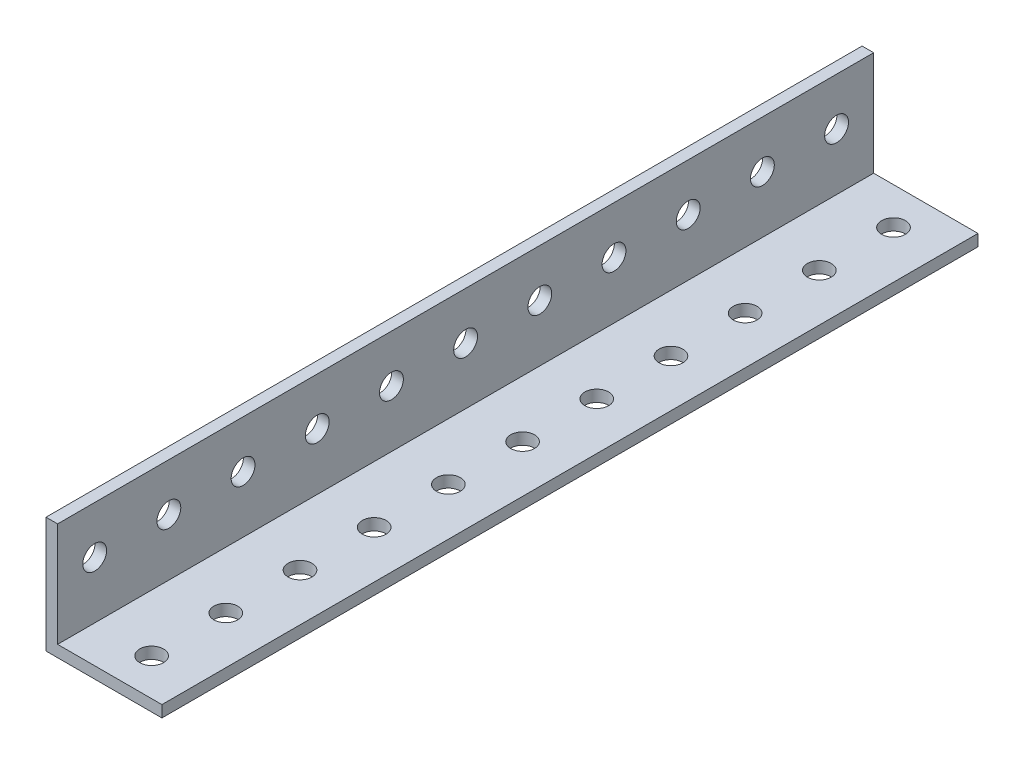
ISO-10303-21;
HEADER;
FILE_DESCRIPTION(('STEP AP214'),'2;1');
FILE_NAME('part.step','',(''),(''),'','','');
FILE_SCHEMA(('AUTOMOTIVE_DESIGN { 1 0 10303 214 1 1 1 1 }'));
ENDSEC;
DATA;
#1=APPLICATION_CONTEXT('core data for automotive mechanical design processes');
#2=APPLICATION_PROTOCOL_DEFINITION('international standard','automotive_design',2000,#1);
#3=PRODUCT_CONTEXT('',#1,'mechanical');
#4=PRODUCT('Part','Part','',(#3));
#5=PRODUCT_RELATED_PRODUCT_CATEGORY('part','',(#4));
#6=PRODUCT_DEFINITION_FORMATION('','',#4);
#7=PRODUCT_DEFINITION_CONTEXT('part definition',#1,'design');
#8=PRODUCT_DEFINITION('design','',#6,#7);
#9=PRODUCT_DEFINITION_SHAPE('','',#8);
#10=(LENGTH_UNIT() NAMED_UNIT(*) SI_UNIT(.MILLI.,.METRE.));
#11=(NAMED_UNIT(*) PLANE_ANGLE_UNIT() SI_UNIT($,.RADIAN.));
#12=(NAMED_UNIT(*) SI_UNIT($,.STERADIAN.) SOLID_ANGLE_UNIT());
#13=UNCERTAINTY_MEASURE_WITH_UNIT(LENGTH_MEASURE(1.E-05),#10,'distance_accuracy_value','');
#14=(GEOMETRIC_REPRESENTATION_CONTEXT(3) GLOBAL_UNCERTAINTY_ASSIGNED_CONTEXT((#13)) GLOBAL_UNIT_ASSIGNED_CONTEXT((#10,
#11,#12)) REPRESENTATION_CONTEXT('',''));
#15=CARTESIAN_POINT('',(0.,0.,0.));
#16=DIRECTION('',(0.,0.,1.));
#17=DIRECTION('',(1.,0.,0.));
#18=AXIS2_PLACEMENT_3D('',#15,#16,#17);
#19=CARTESIAN_POINT('',(1.5875,15.875,111.76));
#20=DIRECTION('',(-1.,0.,0.));
#21=DIRECTION('',(0.,-1.,0.));
#22=AXIS2_PLACEMENT_3D('',#19,#20,#21);
#23=PLANE('',#22);
#24=DIRECTION('',(0.,1.,0.));
#25=VECTOR('',#24,1.);
#26=CARTESIAN_POINT('',(1.5875,15.875,0.));
#27=LINE('',#26,#25);
#28=CARTESIAN_POINT('',(1.5875,1.5875,0.));
#29=VERTEX_POINT('',#28);
#30=CARTESIAN_POINT('',(1.5875,15.875,0.));
#31=VERTEX_POINT('',#30);
#32=EDGE_CURVE('E109',#29,#31,#27,.T.);
#33=ORIENTED_EDGE('',*,*,#32,.T.);
#34=DIRECTION('',(0.,0.,-1.));
#35=VECTOR('',#34,1.);
#36=CARTESIAN_POINT('',(1.5875,15.875,111.76));
#37=LINE('',#36,#35);
#38=CARTESIAN_POINT('',(1.5875,15.875,111.76));
#39=VERTEX_POINT('',#38);
#40=EDGE_CURVE('E106',#39,#31,#37,.T.);
#41=ORIENTED_EDGE('',*,*,#40,.F.);
#42=DIRECTION('',(0.,1.,0.));
#43=VECTOR('',#42,1.);
#44=CARTESIAN_POINT('',(1.5875,15.875,111.76));
#45=LINE('',#44,#43);
#46=CARTESIAN_POINT('',(1.5875,1.5875,111.76));
#47=VERTEX_POINT('',#46);
#48=EDGE_CURVE('E95',#47,#39,#45,.T.);
#49=ORIENTED_EDGE('',*,*,#48,.F.);
#50=DIRECTION('',(0.,0.,-1.));
#51=VECTOR('',#50,1.);
#52=CARTESIAN_POINT('',(1.5875,1.5875,111.76));
#53=LINE('',#52,#51);
#54=EDGE_CURVE('E110',#47,#29,#53,.T.);
#55=ORIENTED_EDGE('',*,*,#54,.T.);
#56=EDGE_LOOP('',(#33,#41,#49,#55));
#57=FACE_BOUND('',#56,.T.);
#58=CARTESIAN_POINT('',(1.5875,9.37260000000001,55.88));
#59=DIRECTION('',(1.,0.,0.));
#60=DIRECTION('',(0.,0.,-1.));
#61=AXIS2_PLACEMENT_3D('',#58,#59,#60);
#62=CIRCLE('',#61,1.63194999999999);
#63=CARTESIAN_POINT('',(1.5875,9.37260000000001,54.24805));
#64=VERTEX_POINT('',#63);
#65=EDGE_CURVE('E169',#64,#64,#62,.T.);
#66=ORIENTED_EDGE('',*,*,#65,.F.);
#67=EDGE_LOOP('',(#66));
#68=FACE_BOUND('',#67,.T.);
#69=CARTESIAN_POINT('',(1.5875,9.37260000000001,45.72));
#70=DIRECTION('',(1.,0.,0.));
#71=DIRECTION('',(0.,0.,-1.));
#72=AXIS2_PLACEMENT_3D('',#69,#70,#71);
#73=CIRCLE('',#72,1.63194999999999);
#74=CARTESIAN_POINT('',(1.5875,9.37260000000001,44.08805));
#75=VERTEX_POINT('',#74);
#76=EDGE_CURVE('E173',#75,#75,#73,.T.);
#77=ORIENTED_EDGE('',*,*,#76,.F.);
#78=EDGE_LOOP('',(#77));
#79=FACE_BOUND('',#78,.T.);
#80=CARTESIAN_POINT('',(1.5875,9.37260000000001,35.56));
#81=DIRECTION('',(1.,0.,0.));
#82=DIRECTION('',(0.,0.,-1.));
#83=AXIS2_PLACEMENT_3D('',#80,#81,#82);
#84=CIRCLE('',#83,1.63194999999999);
#85=CARTESIAN_POINT('',(1.5875,9.37260000000001,33.92805));
#86=VERTEX_POINT('',#85);
#87=EDGE_CURVE('E177',#86,#86,#84,.T.);
#88=ORIENTED_EDGE('',*,*,#87,.F.);
#89=EDGE_LOOP('',(#88));
#90=FACE_BOUND('',#89,.T.);
#91=CARTESIAN_POINT('',(1.5875,9.37260000000001,25.4));
#92=DIRECTION('',(1.,0.,0.));
#93=DIRECTION('',(0.,0.,-1.));
#94=AXIS2_PLACEMENT_3D('',#91,#92,#93);
#95=CIRCLE('',#94,1.63194999999999);
#96=CARTESIAN_POINT('',(1.5875,9.37260000000001,23.76805));
#97=VERTEX_POINT('',#96);
#98=EDGE_CURVE('E181',#97,#97,#95,.T.);
#99=ORIENTED_EDGE('',*,*,#98,.F.);
#100=EDGE_LOOP('',(#99));
#101=FACE_BOUND('',#100,.T.);
#102=CARTESIAN_POINT('',(1.5875,9.37260000000001,15.24));
#103=DIRECTION('',(1.,0.,0.));
#104=DIRECTION('',(0.,0.,-1.));
#105=AXIS2_PLACEMENT_3D('',#102,#103,#104);
#106=CIRCLE('',#105,1.63194999999999);
#107=CARTESIAN_POINT('',(1.5875,9.37260000000001,13.60805));
#108=VERTEX_POINT('',#107);
#109=EDGE_CURVE('E185',#108,#108,#106,.T.);
#110=ORIENTED_EDGE('',*,*,#109,.F.);
#111=EDGE_LOOP('',(#110));
#112=FACE_BOUND('',#111,.T.);
#113=CARTESIAN_POINT('',(1.5875,9.37260000000001,5.08));
#114=DIRECTION('',(1.,0.,0.));
#115=DIRECTION('',(0.,0.,-1.));
#116=AXIS2_PLACEMENT_3D('',#113,#114,#115);
#117=CIRCLE('',#116,1.63194999999999);
#118=CARTESIAN_POINT('',(1.5875,9.37260000000001,3.44805000000001));
#119=VERTEX_POINT('',#118);
#120=EDGE_CURVE('E189',#119,#119,#117,.T.);
#121=ORIENTED_EDGE('',*,*,#120,.F.);
#122=EDGE_LOOP('',(#121));
#123=FACE_BOUND('',#122,.T.);
#124=CARTESIAN_POINT('',(1.5875,9.37260000000001,66.04));
#125=DIRECTION('',(1.,0.,0.));
#126=DIRECTION('',(0.,0.,-1.));
#127=AXIS2_PLACEMENT_3D('',#124,#125,#126);
#128=CIRCLE('',#127,1.63194999999999);
#129=CARTESIAN_POINT('',(1.5875,9.37260000000001,64.40805));
#130=VERTEX_POINT('',#129);
#131=EDGE_CURVE('E193',#130,#130,#128,.T.);
#132=ORIENTED_EDGE('',*,*,#131,.F.);
#133=EDGE_LOOP('',(#132));
#134=FACE_BOUND('',#133,.T.);
#135=CARTESIAN_POINT('',(1.5875,9.37260000000001,76.2));
#136=DIRECTION('',(1.,0.,0.));
#137=DIRECTION('',(0.,0.,-1.));
#138=AXIS2_PLACEMENT_3D('',#135,#136,#137);
#139=CIRCLE('',#138,1.63194999999999);
#140=CARTESIAN_POINT('',(1.5875,9.37260000000001,74.56805));
#141=VERTEX_POINT('',#140);
#142=EDGE_CURVE('E197',#141,#141,#139,.T.);
#143=ORIENTED_EDGE('',*,*,#142,.F.);
#144=EDGE_LOOP('',(#143));
#145=FACE_BOUND('',#144,.T.);
#146=CARTESIAN_POINT('',(1.5875,9.37260000000001,86.36));
#147=DIRECTION('',(1.,0.,0.));
#148=DIRECTION('',(0.,0.,-1.));
#149=AXIS2_PLACEMENT_3D('',#146,#147,#148);
#150=CIRCLE('',#149,1.63194999999999);
#151=CARTESIAN_POINT('',(1.5875,9.37260000000001,84.72805));
#152=VERTEX_POINT('',#151);
#153=EDGE_CURVE('E200',#152,#152,#150,.T.);
#154=ORIENTED_EDGE('',*,*,#153,.F.);
#155=EDGE_LOOP('',(#154));
#156=FACE_BOUND('',#155,.T.);
#157=CARTESIAN_POINT('',(1.5875,9.37260000000001,96.52));
#158=DIRECTION('',(1.,0.,0.));
#159=DIRECTION('',(0.,0.,-1.));
#160=AXIS2_PLACEMENT_3D('',#157,#158,#159);
#161=CIRCLE('',#160,1.63194999999999);
#162=CARTESIAN_POINT('',(1.5875,9.37260000000001,94.88805));
#163=VERTEX_POINT('',#162);
#164=EDGE_CURVE('E203',#163,#163,#161,.T.);
#165=ORIENTED_EDGE('',*,*,#164,.F.);
#166=EDGE_LOOP('',(#165));
#167=FACE_BOUND('',#166,.T.);
#168=CARTESIAN_POINT('',(1.5875,9.37260000000001,106.68));
#169=DIRECTION('',(1.,0.,0.));
#170=DIRECTION('',(0.,0.,-1.));
#171=AXIS2_PLACEMENT_3D('',#168,#169,#170);
#172=CIRCLE('',#171,1.63194999999999);
#173=CARTESIAN_POINT('',(1.5875,9.37260000000001,105.04805));
#174=VERTEX_POINT('',#173);
#175=EDGE_CURVE('E213',#174,#174,#172,.T.);
#176=ORIENTED_EDGE('',*,*,#175,.F.);
#177=EDGE_LOOP('',(#176));
#178=FACE_BOUND('',#177,.T.);
#179=ADVANCED_FACE('F32',(#57,#68,#79,#90,#101,#112,#123,#134,#145,#156,#167,#178),#23,.F.);
#180=CARTESIAN_POINT('',(1.5875,1.5875,111.76));
#181=DIRECTION('',(0.,-1.,0.));
#182=DIRECTION('',(1.,0.,0.));
#183=AXIS2_PLACEMENT_3D('',#180,#181,#182);
#184=PLANE('',#183);
#185=CARTESIAN_POINT('',(9.38529999999999,1.5875,35.56));
#186=DIRECTION('',(0.,1.,0.));
#187=DIRECTION('',(0.,0.,1.));
#188=AXIS2_PLACEMENT_3D('',#185,#186,#187);
#189=CIRCLE('',#188,1.63194999999999);
#190=CARTESIAN_POINT('',(9.38529999999999,1.5875,37.19195));
#191=VERTEX_POINT('',#190);
#192=EDGE_CURVE('E139',#191,#191,#189,.T.);
#193=ORIENTED_EDGE('',*,*,#192,.F.);
#194=EDGE_LOOP('',(#193));
#195=FACE_BOUND('',#194,.T.);
#196=CARTESIAN_POINT('',(9.38529999999999,1.5875,45.72));
#197=DIRECTION('',(0.,1.,0.));
#198=DIRECTION('',(0.,0.,1.));
#199=AXIS2_PLACEMENT_3D('',#196,#197,#198);
#200=CIRCLE('',#199,1.63194999999999);
#201=CARTESIAN_POINT('',(9.38529999999999,1.5875,47.35195));
#202=VERTEX_POINT('',#201);
#203=EDGE_CURVE('E256',#202,#202,#200,.T.);
#204=ORIENTED_EDGE('',*,*,#203,.F.);
#205=EDGE_LOOP('',(#204));
#206=FACE_BOUND('',#205,.T.);
#207=CARTESIAN_POINT('',(9.38529999999999,1.5875,55.88));
#208=DIRECTION('',(0.,1.,0.));
#209=DIRECTION('',(0.,0.,1.));
#210=AXIS2_PLACEMENT_3D('',#207,#208,#209);
#211=CIRCLE('',#210,1.63194999999999);
#212=CARTESIAN_POINT('',(9.38529999999999,1.5875,57.51195));
#213=VERTEX_POINT('',#212);
#214=EDGE_CURVE('E262',#213,#213,#211,.T.);
#215=ORIENTED_EDGE('',*,*,#214,.F.);
#216=EDGE_LOOP('',(#215));
#217=FACE_BOUND('',#216,.T.);
#218=DIRECTION('',(-1.,0.,0.));
#219=VECTOR('',#218,1.);
#220=CARTESIAN_POINT('',(1.5875,1.5875,0.));
#221=LINE('',#220,#219);
#222=CARTESIAN_POINT('',(15.875,1.5875,0.));
#223=VERTEX_POINT('',#222);
#224=EDGE_CURVE('E125',#223,#29,#221,.T.);
#225=ORIENTED_EDGE('',*,*,#224,.T.);
#226=ORIENTED_EDGE('',*,*,#54,.F.);
#227=DIRECTION('',(-1.,0.,0.));
#228=VECTOR('',#227,1.);
#229=CARTESIAN_POINT('',(1.5875,1.5875,111.76));
#230=LINE('',#229,#228);
#231=CARTESIAN_POINT('',(15.875,1.5875,111.76));
#232=VERTEX_POINT('',#231);
#233=EDGE_CURVE('E101',#232,#47,#230,.T.);
#234=ORIENTED_EDGE('',*,*,#233,.F.);
#235=DIRECTION('',(0.,0.,-1.));
#236=VECTOR('',#235,1.);
#237=CARTESIAN_POINT('',(15.875,1.5875,111.76));
#238=LINE('',#237,#236);
#239=EDGE_CURVE('E42',#232,#223,#238,.T.);
#240=ORIENTED_EDGE('',*,*,#239,.T.);
#241=EDGE_LOOP('',(#225,#226,#234,#240));
#242=FACE_BOUND('',#241,.T.);
#243=CARTESIAN_POINT('',(9.38529999999999,1.5875,25.4));
#244=DIRECTION('',(0.,1.,0.));
#245=DIRECTION('',(0.,0.,1.));
#246=AXIS2_PLACEMENT_3D('',#243,#244,#245);
#247=CIRCLE('',#246,1.63194999999999);
#248=CARTESIAN_POINT('',(9.38529999999999,1.5875,27.03195));
#249=VERTEX_POINT('',#248);
#250=EDGE_CURVE('E140',#249,#249,#247,.T.);
#251=ORIENTED_EDGE('',*,*,#250,.F.);
#252=EDGE_LOOP('',(#251));
#253=FACE_BOUND('',#252,.T.);
#254=CARTESIAN_POINT('',(9.38529999999999,1.5875,15.24));
#255=DIRECTION('',(0.,1.,0.));
#256=DIRECTION('',(0.,0.,1.));
#257=AXIS2_PLACEMENT_3D('',#254,#255,#256);
#258=CIRCLE('',#257,1.63194999999999);
#259=CARTESIAN_POINT('',(9.38529999999999,1.5875,16.87195));
#260=VERTEX_POINT('',#259);
#261=EDGE_CURVE('E144',#260,#260,#258,.T.);
#262=ORIENTED_EDGE('',*,*,#261,.F.);
#263=EDGE_LOOP('',(#262));
#264=FACE_BOUND('',#263,.T.);
#265=CARTESIAN_POINT('',(9.38529999999999,1.5875,5.08));
#266=DIRECTION('',(0.,1.,0.));
#267=DIRECTION('',(0.,0.,1.));
#268=AXIS2_PLACEMENT_3D('',#265,#266,#267);
#269=CIRCLE('',#268,1.63194999999999);
#270=CARTESIAN_POINT('',(9.38529999999999,1.5875,6.71194999999999));
#271=VERTEX_POINT('',#270);
#272=EDGE_CURVE('E148',#271,#271,#269,.T.);
#273=ORIENTED_EDGE('',*,*,#272,.F.);
#274=EDGE_LOOP('',(#273));
#275=FACE_BOUND('',#274,.T.);
#276=CARTESIAN_POINT('',(9.38529999999999,1.5875,66.04));
#277=DIRECTION('',(0.,1.,0.));
#278=DIRECTION('',(0.,0.,1.));
#279=AXIS2_PLACEMENT_3D('',#276,#277,#278);
#280=CIRCLE('',#279,1.63194999999999);
#281=CARTESIAN_POINT('',(9.38529999999999,1.5875,67.67195));
#282=VERTEX_POINT('',#281);
#283=EDGE_CURVE('E152',#282,#282,#280,.T.);
#284=ORIENTED_EDGE('',*,*,#283,.F.);
#285=EDGE_LOOP('',(#284));
#286=FACE_BOUND('',#285,.T.);
#287=CARTESIAN_POINT('',(9.38529999999999,1.5875,76.2));
#288=DIRECTION('',(0.,1.,0.));
#289=DIRECTION('',(0.,0.,1.));
#290=AXIS2_PLACEMENT_3D('',#287,#288,#289);
#291=CIRCLE('',#290,1.63194999999999);
#292=CARTESIAN_POINT('',(9.38529999999999,1.5875,77.83195));
#293=VERTEX_POINT('',#292);
#294=EDGE_CURVE('E156',#293,#293,#291,.T.);
#295=ORIENTED_EDGE('',*,*,#294,.F.);
#296=EDGE_LOOP('',(#295));
#297=FACE_BOUND('',#296,.T.);
#298=CARTESIAN_POINT('',(9.38529999999999,1.5875,86.36));
#299=DIRECTION('',(0.,1.,0.));
#300=DIRECTION('',(0.,0.,1.));
#301=AXIS2_PLACEMENT_3D('',#298,#299,#300);
#302=CIRCLE('',#301,1.63194999999999);
#303=CARTESIAN_POINT('',(9.38529999999999,1.5875,87.99195));
#304=VERTEX_POINT('',#303);
#305=EDGE_CURVE('E160',#304,#304,#302,.T.);
#306=ORIENTED_EDGE('',*,*,#305,.F.);
#307=EDGE_LOOP('',(#306));
#308=FACE_BOUND('',#307,.T.);
#309=CARTESIAN_POINT('',(9.38529999999999,1.5875,96.52));
#310=DIRECTION('',(0.,1.,0.));
#311=DIRECTION('',(0.,0.,1.));
#312=AXIS2_PLACEMENT_3D('',#309,#310,#311);
#313=CIRCLE('',#312,1.63194999999999);
#314=CARTESIAN_POINT('',(9.38529999999999,1.5875,98.15195));
#315=VERTEX_POINT('',#314);
#316=EDGE_CURVE('E161',#315,#315,#313,.T.);
#317=ORIENTED_EDGE('',*,*,#316,.F.);
#318=EDGE_LOOP('',(#317));
#319=FACE_BOUND('',#318,.T.);
#320=CARTESIAN_POINT('',(9.38529999999999,1.5875,106.68));
#321=DIRECTION('',(0.,1.,0.));
#322=DIRECTION('',(0.,0.,1.));
#323=AXIS2_PLACEMENT_3D('',#320,#321,#322);
#324=CIRCLE('',#323,1.63194999999999);
#325=CARTESIAN_POINT('',(9.38529999999999,1.5875,108.31195));
#326=VERTEX_POINT('',#325);
#327=EDGE_CURVE('E165',#326,#326,#324,.T.);
#328=ORIENTED_EDGE('',*,*,#327,.F.);
#329=EDGE_LOOP('',(#328));
#330=FACE_BOUND('',#329,.T.);
#331=ADVANCED_FACE('F273',(#195,#206,#217,#242,#253,#264,#275,#286,#297,#308,#319,#330),#184,.F.);
#332=CARTESIAN_POINT('',(15.875,0.,111.76));
#333=DIRECTION('',(0.,1.,0.));
#334=DIRECTION('',(-1.,0.,0.));
#335=AXIS2_PLACEMENT_3D('',#332,#333,#334);
#336=PLANE('',#335);
#337=CARTESIAN_POINT('',(9.38529999999999,0.,106.68));
#338=DIRECTION('',(0.,1.,0.));
#339=DIRECTION('',(-1.,0.,0.));
#340=AXIS2_PLACEMENT_3D('',#337,#338,#339);
#341=CIRCLE('',#340,1.63194999999999);
#342=CARTESIAN_POINT('',(7.75335,0.,106.68));
#343=VERTEX_POINT('',#342);
#344=EDGE_CURVE('E162',#343,#343,#341,.T.);
#345=ORIENTED_EDGE('',*,*,#344,.T.);
#346=EDGE_LOOP('',(#345));
#347=FACE_BOUND('',#346,.T.);
#348=CARTESIAN_POINT('',(9.38529999999999,0.,96.52));
#349=DIRECTION('',(0.,1.,0.));
#350=DIRECTION('',(-1.,0.,0.));
#351=AXIS2_PLACEMENT_3D('',#348,#349,#350);
#352=CIRCLE('',#351,1.63194999999999);
#353=CARTESIAN_POINT('',(7.75335,0.,96.52));
#354=VERTEX_POINT('',#353);
#355=EDGE_CURVE('E157',#354,#354,#352,.T.);
#356=ORIENTED_EDGE('',*,*,#355,.T.);
#357=EDGE_LOOP('',(#356));
#358=FACE_BOUND('',#357,.T.);
#359=CARTESIAN_POINT('',(9.38529999999999,0.,86.36));
#360=DIRECTION('',(0.,1.,0.));
#361=DIRECTION('',(-1.,0.,0.));
#362=AXIS2_PLACEMENT_3D('',#359,#360,#361);
#363=CIRCLE('',#362,1.63194999999999);
#364=CARTESIAN_POINT('',(7.75335,0.,86.36));
#365=VERTEX_POINT('',#364);
#366=EDGE_CURVE('E238',#365,#365,#363,.T.);
#367=ORIENTED_EDGE('',*,*,#366,.T.);
#368=EDGE_LOOP('',(#367));
#369=FACE_BOUND('',#368,.T.);
#370=CARTESIAN_POINT('',(9.38529999999999,0.,76.2));
#371=DIRECTION('',(0.,1.,0.));
#372=DIRECTION('',(-1.,0.,0.));
#373=AXIS2_PLACEMENT_3D('',#370,#371,#372);
#374=CIRCLE('',#373,1.63194999999999);
#375=CARTESIAN_POINT('',(7.75335,0.,76.2));
#376=VERTEX_POINT('',#375);
#377=EDGE_CURVE('E153',#376,#376,#374,.T.);
#378=ORIENTED_EDGE('',*,*,#377,.T.);
#379=EDGE_LOOP('',(#378));
#380=FACE_BOUND('',#379,.T.);
#381=CARTESIAN_POINT('',(9.38529999999999,0.,66.04));
#382=DIRECTION('',(0.,1.,0.));
#383=DIRECTION('',(-1.,0.,0.));
#384=AXIS2_PLACEMENT_3D('',#381,#382,#383);
#385=CIRCLE('',#384,1.63194999999999);
#386=CARTESIAN_POINT('',(7.75335,0.,66.04));
#387=VERTEX_POINT('',#386);
#388=EDGE_CURVE('E149',#387,#387,#385,.T.);
#389=ORIENTED_EDGE('',*,*,#388,.T.);
#390=EDGE_LOOP('',(#389));
#391=FACE_BOUND('',#390,.T.);
#392=CARTESIAN_POINT('',(9.38529999999999,0.,5.08));
#393=DIRECTION('',(0.,1.,0.));
#394=DIRECTION('',(-1.,0.,0.));
#395=AXIS2_PLACEMENT_3D('',#392,#393,#394);
#396=CIRCLE('',#395,1.63194999999999);
#397=CARTESIAN_POINT('',(7.75335,0.,5.08));
#398=VERTEX_POINT('',#397);
#399=EDGE_CURVE('E145',#398,#398,#396,.T.);
#400=ORIENTED_EDGE('',*,*,#399,.T.);
#401=EDGE_LOOP('',(#400));
#402=FACE_BOUND('',#401,.T.);
#403=CARTESIAN_POINT('',(9.38529999999999,0.,15.24));
#404=DIRECTION('',(0.,1.,0.));
#405=DIRECTION('',(-1.,0.,0.));
#406=AXIS2_PLACEMENT_3D('',#403,#404,#405);
#407=CIRCLE('',#406,1.63194999999999);
#408=CARTESIAN_POINT('',(7.75335,0.,15.24));
#409=VERTEX_POINT('',#408);
#410=EDGE_CURVE('E141',#409,#409,#407,.T.);
#411=ORIENTED_EDGE('',*,*,#410,.T.);
#412=EDGE_LOOP('',(#411));
#413=FACE_BOUND('',#412,.T.);
#414=CARTESIAN_POINT('',(9.38529999999999,0.,25.4));
#415=DIRECTION('',(0.,1.,0.));
#416=DIRECTION('',(-1.,0.,0.));
#417=AXIS2_PLACEMENT_3D('',#414,#415,#416);
#418=CIRCLE('',#417,1.63194999999999);
#419=CARTESIAN_POINT('',(7.75335,0.,25.4));
#420=VERTEX_POINT('',#419);
#421=EDGE_CURVE('E136',#420,#420,#418,.T.);
#422=ORIENTED_EDGE('',*,*,#421,.T.);
#423=EDGE_LOOP('',(#422));
#424=FACE_BOUND('',#423,.T.);
#425=CARTESIAN_POINT('',(9.38529999999999,0.,35.56));
#426=DIRECTION('',(0.,1.,0.));
#427=DIRECTION('',(-1.,0.,0.));
#428=AXIS2_PLACEMENT_3D('',#425,#426,#427);
#429=CIRCLE('',#428,1.63194999999999);
#430=CARTESIAN_POINT('',(7.75335,0.,35.56));
#431=VERTEX_POINT('',#430);
#432=EDGE_CURVE('E253',#431,#431,#429,.T.);
#433=ORIENTED_EDGE('',*,*,#432,.T.);
#434=EDGE_LOOP('',(#433));
#435=FACE_BOUND('',#434,.T.);
#436=CARTESIAN_POINT('',(9.38529999999999,0.,45.72));
#437=DIRECTION('',(0.,1.,0.));
#438=DIRECTION('',(-1.,0.,0.));
#439=AXIS2_PLACEMENT_3D('',#436,#437,#438);
#440=CIRCLE('',#439,1.63194999999999);
#441=CARTESIAN_POINT('',(7.75335,0.,45.72));
#442=VERTEX_POINT('',#441);
#443=EDGE_CURVE('E259',#442,#442,#440,.T.);
#444=ORIENTED_EDGE('',*,*,#443,.T.);
#445=EDGE_LOOP('',(#444));
#446=FACE_BOUND('',#445,.T.);
#447=CARTESIAN_POINT('',(9.38529999999999,0.,55.88));
#448=DIRECTION('',(0.,1.,0.));
#449=DIRECTION('',(-1.,0.,0.));
#450=AXIS2_PLACEMENT_3D('',#447,#448,#449);
#451=CIRCLE('',#450,1.63194999999999);
#452=CARTESIAN_POINT('',(7.75335,0.,55.88));
#453=VERTEX_POINT('',#452);
#454=EDGE_CURVE('E123',#453,#453,#451,.T.);
#455=ORIENTED_EDGE('',*,*,#454,.T.);
#456=EDGE_LOOP('',(#455));
#457=FACE_BOUND('',#456,.T.);
#458=DIRECTION('',(1.,0.,0.));
#459=VECTOR('',#458,1.);
#460=CARTESIAN_POINT('',(15.875,0.,0.));
#461=LINE('',#460,#459);
#462=CARTESIAN_POINT('',(0.,0.,0.));
#463=VERTEX_POINT('',#462);
#464=CARTESIAN_POINT('',(15.875,0.,0.));
#465=VERTEX_POINT('',#464);
#466=EDGE_CURVE('E119',#463,#465,#461,.T.);
#467=ORIENTED_EDGE('',*,*,#466,.T.);
#468=DIRECTION('',(0.,0.,-1.));
#469=VECTOR('',#468,1.);
#470=CARTESIAN_POINT('',(15.875,0.,111.76));
#471=LINE('',#470,#469);
#472=CARTESIAN_POINT('',(15.875,0.,111.76));
#473=VERTEX_POINT('',#472);
#474=EDGE_CURVE('E11',#473,#465,#471,.T.);
#475=ORIENTED_EDGE('',*,*,#474,.F.);
#476=DIRECTION('',(1.,0.,0.));
#477=VECTOR('',#476,1.);
#478=CARTESIAN_POINT('',(15.875,0.,111.76));
#479=LINE('',#478,#477);
#480=CARTESIAN_POINT('',(0.,0.,111.76));
#481=VERTEX_POINT('',#480);
#482=EDGE_CURVE('E130',#481,#473,#479,.T.);
#483=ORIENTED_EDGE('',*,*,#482,.F.);
#484=DIRECTION('',(0.,0.,-1.));
#485=VECTOR('',#484,1.);
#486=CARTESIAN_POINT('',(0.,0.,111.76));
#487=LINE('',#486,#485);
#488=EDGE_CURVE('E115',#481,#463,#487,.T.);
#489=ORIENTED_EDGE('',*,*,#488,.T.);
#490=EDGE_LOOP('',(#467,#475,#483,#489));
#491=FACE_BOUND('',#490,.T.);
#492=ADVANCED_FACE('F34',(#347,#358,#369,#380,#391,#402,#413,#424,#435,#446,#457,#491),#336,.F.);
#493=CARTESIAN_POINT('',(15.875,1.5875,111.76));
#494=DIRECTION('',(-1.,0.,0.));
#495=DIRECTION('',(0.,0.,1.));
#496=AXIS2_PLACEMENT_3D('',#493,#494,#495);
#497=PLANE('',#496);
#498=DIRECTION('',(0.,1.,0.));
#499=VECTOR('',#498,1.);
#500=CARTESIAN_POINT('',(15.875,1.5875,0.));
#501=LINE('',#500,#499);
#502=EDGE_CURVE('E122',#465,#223,#501,.T.);
#503=ORIENTED_EDGE('',*,*,#502,.T.);
#504=ORIENTED_EDGE('',*,*,#239,.F.);
#505=DIRECTION('',(0.,1.,0.));
#506=VECTOR('',#505,1.);
#507=CARTESIAN_POINT('',(15.875,1.5875,111.76));
#508=LINE('',#507,#506);
#509=EDGE_CURVE('E88',#473,#232,#508,.T.);
#510=ORIENTED_EDGE('',*,*,#509,.F.);
#511=ORIENTED_EDGE('',*,*,#474,.T.);
#512=EDGE_LOOP('',(#503,#504,#510,#511));
#513=FACE_BOUND('',#512,.T.);
#514=ADVANCED_FACE('F270',(#513),#497,.F.);
#515=CARTESIAN_POINT('',(0.,15.875,111.76));
#516=DIRECTION('',(0.,-1.,0.));
#517=DIRECTION('',(0.,0.,-1.));
#518=AXIS2_PLACEMENT_3D('',#515,#516,#517);
#519=PLANE('',#518);
#520=DIRECTION('',(-1.,0.,0.));
#521=VECTOR('',#520,1.);
#522=CARTESIAN_POINT('',(0.,15.875,0.));
#523=LINE('',#522,#521);
#524=CARTESIAN_POINT('',(0.,15.875,0.));
#525=VERTEX_POINT('',#524);
#526=EDGE_CURVE('E74',#31,#525,#523,.T.);
#527=ORIENTED_EDGE('',*,*,#526,.T.);
#528=DIRECTION('',(0.,0.,-1.));
#529=VECTOR('',#528,1.);
#530=CARTESIAN_POINT('',(0.,15.875,111.76));
#531=LINE('',#530,#529);
#532=CARTESIAN_POINT('',(0.,15.875,111.76));
#533=VERTEX_POINT('',#532);
#534=EDGE_CURVE('E111',#533,#525,#531,.T.);
#535=ORIENTED_EDGE('',*,*,#534,.F.);
#536=DIRECTION('',(-1.,0.,0.));
#537=VECTOR('',#536,1.);
#538=CARTESIAN_POINT('',(0.,15.875,111.76));
#539=LINE('',#538,#537);
#540=EDGE_CURVE('E99',#39,#533,#539,.T.);
#541=ORIENTED_EDGE('',*,*,#540,.F.);
#542=ORIENTED_EDGE('',*,*,#40,.T.);
#543=EDGE_LOOP('',(#527,#535,#541,#542));
#544=FACE_BOUND('',#543,.T.);
#545=ADVANCED_FACE('F113',(#544),#519,.F.);
#546=CARTESIAN_POINT('',(0.,0.,111.76));
#547=DIRECTION('',(1.,0.,0.));
#548=DIRECTION('',(0.,0.,-1.));
#549=AXIS2_PLACEMENT_3D('',#546,#547,#548);
#550=PLANE('',#549);
#551=CARTESIAN_POINT('',(0.,9.37260000000001,106.68));
#552=DIRECTION('',(1.,0.,0.));
#553=DIRECTION('',(0.,0.,-1.));
#554=AXIS2_PLACEMENT_3D('',#551,#552,#553);
#555=CIRCLE('',#554,1.63194999999999);
#556=CARTESIAN_POINT('',(0.,9.37260000000001,105.04805));
#557=VERTEX_POINT('',#556);
#558=EDGE_CURVE('E36',#557,#557,#555,.T.);
#559=ORIENTED_EDGE('',*,*,#558,.T.);
#560=EDGE_LOOP('',(#559));
#561=FACE_BOUND('',#560,.T.);
#562=CARTESIAN_POINT('',(0.,9.37260000000001,96.52));
#563=DIRECTION('',(1.,0.,0.));
#564=DIRECTION('',(0.,0.,-1.));
#565=AXIS2_PLACEMENT_3D('',#562,#563,#564);
#566=CIRCLE('',#565,1.63194999999999);
#567=CARTESIAN_POINT('',(0.,9.37260000000001,94.88805));
#568=VERTEX_POINT('',#567);
#569=EDGE_CURVE('E201',#568,#568,#566,.T.);
#570=ORIENTED_EDGE('',*,*,#569,.T.);
#571=EDGE_LOOP('',(#570));
#572=FACE_BOUND('',#571,.T.);
#573=CARTESIAN_POINT('',(0.,9.37260000000001,86.36));
#574=DIRECTION('',(1.,0.,0.));
#575=DIRECTION('',(0.,0.,-1.));
#576=AXIS2_PLACEMENT_3D('',#573,#574,#575);
#577=CIRCLE('',#576,1.63194999999999);
#578=CARTESIAN_POINT('',(0.,9.37260000000001,84.72805));
#579=VERTEX_POINT('',#578);
#580=EDGE_CURVE('E198',#579,#579,#577,.T.);
#581=ORIENTED_EDGE('',*,*,#580,.T.);
#582=EDGE_LOOP('',(#581));
#583=FACE_BOUND('',#582,.T.);
#584=CARTESIAN_POINT('',(0.,9.37260000000001,76.2));
#585=DIRECTION('',(1.,0.,0.));
#586=DIRECTION('',(0.,0.,-1.));
#587=AXIS2_PLACEMENT_3D('',#584,#585,#586);
#588=CIRCLE('',#587,1.63194999999999);
#589=CARTESIAN_POINT('',(0.,9.37260000000001,74.56805));
#590=VERTEX_POINT('',#589);
#591=EDGE_CURVE('E194',#590,#590,#588,.T.);
#592=ORIENTED_EDGE('',*,*,#591,.T.);
#593=EDGE_LOOP('',(#592));
#594=FACE_BOUND('',#593,.T.);
#595=CARTESIAN_POINT('',(0.,9.37260000000001,66.04));
#596=DIRECTION('',(1.,0.,0.));
#597=DIRECTION('',(0.,0.,-1.));
#598=AXIS2_PLACEMENT_3D('',#595,#596,#597);
#599=CIRCLE('',#598,1.63194999999999);
#600=CARTESIAN_POINT('',(0.,9.37260000000001,64.40805));
#601=VERTEX_POINT('',#600);
#602=EDGE_CURVE('E190',#601,#601,#599,.T.);
#603=ORIENTED_EDGE('',*,*,#602,.T.);
#604=EDGE_LOOP('',(#603));
#605=FACE_BOUND('',#604,.T.);
#606=CARTESIAN_POINT('',(0.,9.37260000000001,5.08));
#607=DIRECTION('',(1.,0.,0.));
#608=DIRECTION('',(0.,0.,-1.));
#609=AXIS2_PLACEMENT_3D('',#606,#607,#608);
#610=CIRCLE('',#609,1.63194999999999);
#611=CARTESIAN_POINT('',(0.,9.37260000000001,3.44805000000001));
#612=VERTEX_POINT('',#611);
#613=EDGE_CURVE('E186',#612,#612,#610,.T.);
#614=ORIENTED_EDGE('',*,*,#613,.T.);
#615=EDGE_LOOP('',(#614));
#616=FACE_BOUND('',#615,.T.);
#617=CARTESIAN_POINT('',(0.,9.37260000000001,15.24));
#618=DIRECTION('',(1.,0.,0.));
#619=DIRECTION('',(0.,0.,-1.));
#620=AXIS2_PLACEMENT_3D('',#617,#618,#619);
#621=CIRCLE('',#620,1.63194999999999);
#622=CARTESIAN_POINT('',(0.,9.37260000000001,13.60805));
#623=VERTEX_POINT('',#622);
#624=EDGE_CURVE('E182',#623,#623,#621,.T.);
#625=ORIENTED_EDGE('',*,*,#624,.T.);
#626=EDGE_LOOP('',(#625));
#627=FACE_BOUND('',#626,.T.);
#628=CARTESIAN_POINT('',(0.,9.37260000000001,25.4));
#629=DIRECTION('',(1.,0.,0.));
#630=DIRECTION('',(0.,0.,-1.));
#631=AXIS2_PLACEMENT_3D('',#628,#629,#630);
#632=CIRCLE('',#631,1.63194999999999);
#633=CARTESIAN_POINT('',(0.,9.37260000000001,23.76805));
#634=VERTEX_POINT('',#633);
#635=EDGE_CURVE('E178',#634,#634,#632,.T.);
#636=ORIENTED_EDGE('',*,*,#635,.T.);
#637=EDGE_LOOP('',(#636));
#638=FACE_BOUND('',#637,.T.);
#639=CARTESIAN_POINT('',(0.,9.37260000000001,35.56));
#640=DIRECTION('',(1.,0.,0.));
#641=DIRECTION('',(0.,0.,-1.));
#642=AXIS2_PLACEMENT_3D('',#639,#640,#641);
#643=CIRCLE('',#642,1.63194999999999);
#644=CARTESIAN_POINT('',(0.,9.37260000000001,33.92805));
#645=VERTEX_POINT('',#644);
#646=EDGE_CURVE('E174',#645,#645,#643,.T.);
#647=ORIENTED_EDGE('',*,*,#646,.T.);
#648=EDGE_LOOP('',(#647));
#649=FACE_BOUND('',#648,.T.);
#650=CARTESIAN_POINT('',(0.,9.37260000000001,45.72));
#651=DIRECTION('',(1.,0.,0.));
#652=DIRECTION('',(0.,0.,-1.));
#653=AXIS2_PLACEMENT_3D('',#650,#651,#652);
#654=CIRCLE('',#653,1.63194999999999);
#655=CARTESIAN_POINT('',(0.,9.37260000000001,44.08805));
#656=VERTEX_POINT('',#655);
#657=EDGE_CURVE('E170',#656,#656,#654,.T.);
#658=ORIENTED_EDGE('',*,*,#657,.T.);
#659=EDGE_LOOP('',(#658));
#660=FACE_BOUND('',#659,.T.);
#661=CARTESIAN_POINT('',(0.,9.37260000000001,55.88));
#662=DIRECTION('',(1.,0.,0.));
#663=DIRECTION('',(0.,0.,-1.));
#664=AXIS2_PLACEMENT_3D('',#661,#662,#663);
#665=CIRCLE('',#664,1.63194999999999);
#666=CARTESIAN_POINT('',(0.,9.37260000000001,54.24805));
#667=VERTEX_POINT('',#666);
#668=EDGE_CURVE('E166',#667,#667,#665,.T.);
#669=ORIENTED_EDGE('',*,*,#668,.T.);
#670=EDGE_LOOP('',(#669));
#671=FACE_BOUND('',#670,.T.);
#672=DIRECTION('',(0.,-1.,0.));
#673=VECTOR('',#672,1.);
#674=CARTESIAN_POINT('',(0.,0.,0.));
#675=LINE('',#674,#673);
#676=EDGE_CURVE('E80',#525,#463,#675,.T.);
#677=ORIENTED_EDGE('',*,*,#676,.T.);
#678=ORIENTED_EDGE('',*,*,#488,.F.);
#679=DIRECTION('',(0.,-1.,0.));
#680=VECTOR('',#679,1.);
#681=CARTESIAN_POINT('',(0.,0.,111.76));
#682=LINE('',#681,#680);
#683=EDGE_CURVE('E51',#533,#481,#682,.T.);
#684=ORIENTED_EDGE('',*,*,#683,.F.);
#685=ORIENTED_EDGE('',*,*,#534,.T.);
#686=EDGE_LOOP('',(#677,#678,#684,#685));
#687=FACE_BOUND('',#686,.T.);
#688=ADVANCED_FACE('F279',(#561,#572,#583,#594,#605,#616,#627,#638,#649,#660,#671,#687),#550,.F.);
#689=CARTESIAN_POINT('',(0.,0.,111.76));
#690=DIRECTION('',(0.,0.,-1.));
#691=DIRECTION('',(-1.,0.,0.));
#692=AXIS2_PLACEMENT_3D('',#689,#690,#691);
#693=PLANE('',#692);
#694=ORIENTED_EDGE('',*,*,#482,.T.);
#695=ORIENTED_EDGE('',*,*,#509,.T.);
#696=ORIENTED_EDGE('',*,*,#233,.T.);
#697=ORIENTED_EDGE('',*,*,#48,.T.);
#698=ORIENTED_EDGE('',*,*,#540,.T.);
#699=ORIENTED_EDGE('',*,*,#683,.T.);
#700=EDGE_LOOP('',(#694,#695,#696,#697,#698,#699));
#701=FACE_BOUND('',#700,.T.);
#702=ADVANCED_FACE('F97',(#701),#693,.F.);
#703=CARTESIAN_POINT('',(0.,0.,0.));
#704=DIRECTION('',(0.,0.,-1.));
#705=DIRECTION('',(-1.,0.,0.));
#706=AXIS2_PLACEMENT_3D('',#703,#704,#705);
#707=PLANE('',#706);
#708=ORIENTED_EDGE('',*,*,#466,.F.);
#709=ORIENTED_EDGE('',*,*,#676,.F.);
#710=ORIENTED_EDGE('',*,*,#526,.F.);
#711=ORIENTED_EDGE('',*,*,#32,.F.);
#712=ORIENTED_EDGE('',*,*,#224,.F.);
#713=ORIENTED_EDGE('',*,*,#502,.F.);
#714=EDGE_LOOP('',(#708,#709,#710,#711,#712,#713));
#715=FACE_BOUND('',#714,.T.);
#716=ADVANCED_FACE('F277',(#715),#707,.T.);
#717=CARTESIAN_POINT('',(9.38529999999999,1.5875,55.88));
#718=DIRECTION('',(0.,1.,0.));
#719=DIRECTION('',(0.,0.,1.));
#720=AXIS2_PLACEMENT_3D('',#717,#718,#719);
#721=CYLINDRICAL_SURFACE('',#720,1.63194999999999);
#722=ORIENTED_EDGE('',*,*,#214,.T.);
#723=EDGE_LOOP('',(#722));
#724=FACE_BOUND('',#723,.T.);
#725=ORIENTED_EDGE('',*,*,#454,.F.);
#726=EDGE_LOOP('',(#725));
#727=FACE_BOUND('',#726,.T.);
#728=ADVANCED_FACE('F326',(#724,#727),#721,.F.);
#729=CARTESIAN_POINT('',(9.38529999999999,1.5875,45.72));
#730=DIRECTION('',(0.,1.,0.));
#731=DIRECTION('',(0.,0.,1.));
#732=AXIS2_PLACEMENT_3D('',#729,#730,#731);
#733=CYLINDRICAL_SURFACE('',#732,1.63194999999999);
#734=ORIENTED_EDGE('',*,*,#203,.T.);
#735=EDGE_LOOP('',(#734));
#736=FACE_BOUND('',#735,.T.);
#737=ORIENTED_EDGE('',*,*,#443,.F.);
#738=EDGE_LOOP('',(#737));
#739=FACE_BOUND('',#738,.T.);
#740=ADVANCED_FACE('F328',(#736,#739),#733,.F.);
#741=CARTESIAN_POINT('',(9.38529999999999,1.5875,35.56));
#742=DIRECTION('',(0.,1.,0.));
#743=DIRECTION('',(0.,0.,1.));
#744=AXIS2_PLACEMENT_3D('',#741,#742,#743);
#745=CYLINDRICAL_SURFACE('',#744,1.63194999999999);
#746=ORIENTED_EDGE('',*,*,#192,.T.);
#747=EDGE_LOOP('',(#746));
#748=FACE_BOUND('',#747,.T.);
#749=ORIENTED_EDGE('',*,*,#432,.F.);
#750=EDGE_LOOP('',(#749));
#751=FACE_BOUND('',#750,.T.);
#752=ADVANCED_FACE('F335',(#748,#751),#745,.F.);
#753=CARTESIAN_POINT('',(9.38529999999999,1.5875,25.4));
#754=DIRECTION('',(0.,1.,0.));
#755=DIRECTION('',(0.,0.,1.));
#756=AXIS2_PLACEMENT_3D('',#753,#754,#755);
#757=CYLINDRICAL_SURFACE('',#756,1.63194999999999);
#758=ORIENTED_EDGE('',*,*,#250,.T.);
#759=EDGE_LOOP('',(#758));
#760=FACE_BOUND('',#759,.T.);
#761=ORIENTED_EDGE('',*,*,#421,.F.);
#762=EDGE_LOOP('',(#761));
#763=FACE_BOUND('',#762,.T.);
#764=ADVANCED_FACE('F341',(#760,#763),#757,.F.);
#765=CARTESIAN_POINT('',(9.38529999999999,1.5875,15.24));
#766=DIRECTION('',(0.,1.,0.));
#767=DIRECTION('',(0.,0.,1.));
#768=AXIS2_PLACEMENT_3D('',#765,#766,#767);
#769=CYLINDRICAL_SURFACE('',#768,1.63194999999999);
#770=ORIENTED_EDGE('',*,*,#261,.T.);
#771=EDGE_LOOP('',(#770));
#772=FACE_BOUND('',#771,.T.);
#773=ORIENTED_EDGE('',*,*,#410,.F.);
#774=EDGE_LOOP('',(#773));
#775=FACE_BOUND('',#774,.T.);
#776=ADVANCED_FACE('F345',(#772,#775),#769,.F.);
#777=CARTESIAN_POINT('',(9.38529999999999,1.5875,5.08));
#778=DIRECTION('',(0.,1.,0.));
#779=DIRECTION('',(0.,0.,1.));
#780=AXIS2_PLACEMENT_3D('',#777,#778,#779);
#781=CYLINDRICAL_SURFACE('',#780,1.63194999999999);
#782=ORIENTED_EDGE('',*,*,#272,.T.);
#783=EDGE_LOOP('',(#782));
#784=FACE_BOUND('',#783,.T.);
#785=ORIENTED_EDGE('',*,*,#399,.F.);
#786=EDGE_LOOP('',(#785));
#787=FACE_BOUND('',#786,.T.);
#788=ADVANCED_FACE('F349',(#784,#787),#781,.F.);
#789=CARTESIAN_POINT('',(9.38529999999999,1.5875,66.04));
#790=DIRECTION('',(0.,1.,0.));
#791=DIRECTION('',(0.,0.,1.));
#792=AXIS2_PLACEMENT_3D('',#789,#790,#791);
#793=CYLINDRICAL_SURFACE('',#792,1.63194999999999);
#794=ORIENTED_EDGE('',*,*,#283,.T.);
#795=EDGE_LOOP('',(#794));
#796=FACE_BOUND('',#795,.T.);
#797=ORIENTED_EDGE('',*,*,#388,.F.);
#798=EDGE_LOOP('',(#797));
#799=FACE_BOUND('',#798,.T.);
#800=ADVANCED_FACE('F353',(#796,#799),#793,.F.);
#801=CARTESIAN_POINT('',(9.38529999999999,1.5875,76.2));
#802=DIRECTION('',(0.,1.,0.));
#803=DIRECTION('',(0.,0.,1.));
#804=AXIS2_PLACEMENT_3D('',#801,#802,#803);
#805=CYLINDRICAL_SURFACE('',#804,1.63194999999999);
#806=ORIENTED_EDGE('',*,*,#294,.T.);
#807=EDGE_LOOP('',(#806));
#808=FACE_BOUND('',#807,.T.);
#809=ORIENTED_EDGE('',*,*,#377,.F.);
#810=EDGE_LOOP('',(#809));
#811=FACE_BOUND('',#810,.T.);
#812=ADVANCED_FACE('F357',(#808,#811),#805,.F.);
#813=CARTESIAN_POINT('',(9.38529999999999,1.5875,86.36));
#814=DIRECTION('',(0.,1.,0.));
#815=DIRECTION('',(0.,0.,1.));
#816=AXIS2_PLACEMENT_3D('',#813,#814,#815);
#817=CYLINDRICAL_SURFACE('',#816,1.63194999999999);
#818=ORIENTED_EDGE('',*,*,#305,.T.);
#819=EDGE_LOOP('',(#818));
#820=FACE_BOUND('',#819,.T.);
#821=ORIENTED_EDGE('',*,*,#366,.F.);
#822=EDGE_LOOP('',(#821));
#823=FACE_BOUND('',#822,.T.);
#824=ADVANCED_FACE('F361',(#820,#823),#817,.F.);
#825=CARTESIAN_POINT('',(9.38529999999999,1.5875,96.52));
#826=DIRECTION('',(0.,1.,0.));
#827=DIRECTION('',(0.,0.,1.));
#828=AXIS2_PLACEMENT_3D('',#825,#826,#827);
#829=CYLINDRICAL_SURFACE('',#828,1.63194999999999);
#830=ORIENTED_EDGE('',*,*,#316,.T.);
#831=EDGE_LOOP('',(#830));
#832=FACE_BOUND('',#831,.T.);
#833=ORIENTED_EDGE('',*,*,#355,.F.);
#834=EDGE_LOOP('',(#833));
#835=FACE_BOUND('',#834,.T.);
#836=ADVANCED_FACE('F365',(#832,#835),#829,.F.);
#837=CARTESIAN_POINT('',(9.38529999999999,1.5875,106.68));
#838=DIRECTION('',(0.,1.,0.));
#839=DIRECTION('',(0.,0.,1.));
#840=AXIS2_PLACEMENT_3D('',#837,#838,#839);
#841=CYLINDRICAL_SURFACE('',#840,1.63194999999999);
#842=ORIENTED_EDGE('',*,*,#327,.T.);
#843=EDGE_LOOP('',(#842));
#844=FACE_BOUND('',#843,.T.);
#845=ORIENTED_EDGE('',*,*,#344,.F.);
#846=EDGE_LOOP('',(#845));
#847=FACE_BOUND('',#846,.T.);
#848=ADVANCED_FACE('F369',(#844,#847),#841,.F.);
#849=CARTESIAN_POINT('',(1.5875,9.37260000000001,55.88));
#850=DIRECTION('',(1.,0.,0.));
#851=DIRECTION('',(0.,0.,-1.));
#852=AXIS2_PLACEMENT_3D('',#849,#850,#851);
#853=CYLINDRICAL_SURFACE('',#852,1.63194999999999);
#854=ORIENTED_EDGE('',*,*,#65,.T.);
#855=EDGE_LOOP('',(#854));
#856=FACE_BOUND('',#855,.T.);
#857=ORIENTED_EDGE('',*,*,#668,.F.);
#858=EDGE_LOOP('',(#857));
#859=FACE_BOUND('',#858,.T.);
#860=ADVANCED_FACE('F373',(#856,#859),#853,.F.);
#861=CARTESIAN_POINT('',(1.5875,9.37260000000001,45.72));
#862=DIRECTION('',(1.,0.,0.));
#863=DIRECTION('',(0.,0.,-1.));
#864=AXIS2_PLACEMENT_3D('',#861,#862,#863);
#865=CYLINDRICAL_SURFACE('',#864,1.63194999999999);
#866=ORIENTED_EDGE('',*,*,#76,.T.);
#867=EDGE_LOOP('',(#866));
#868=FACE_BOUND('',#867,.T.);
#869=ORIENTED_EDGE('',*,*,#657,.F.);
#870=EDGE_LOOP('',(#869));
#871=FACE_BOUND('',#870,.T.);
#872=ADVANCED_FACE('F377',(#868,#871),#865,.F.);
#873=CARTESIAN_POINT('',(1.5875,9.37260000000001,35.56));
#874=DIRECTION('',(1.,0.,0.));
#875=DIRECTION('',(0.,0.,-1.));
#876=AXIS2_PLACEMENT_3D('',#873,#874,#875);
#877=CYLINDRICAL_SURFACE('',#876,1.63194999999999);
#878=ORIENTED_EDGE('',*,*,#87,.T.);
#879=EDGE_LOOP('',(#878));
#880=FACE_BOUND('',#879,.T.);
#881=ORIENTED_EDGE('',*,*,#646,.F.);
#882=EDGE_LOOP('',(#881));
#883=FACE_BOUND('',#882,.T.);
#884=ADVANCED_FACE('F381',(#880,#883),#877,.F.);
#885=CARTESIAN_POINT('',(1.5875,9.37260000000001,25.4));
#886=DIRECTION('',(1.,0.,0.));
#887=DIRECTION('',(0.,0.,-1.));
#888=AXIS2_PLACEMENT_3D('',#885,#886,#887);
#889=CYLINDRICAL_SURFACE('',#888,1.63194999999999);
#890=ORIENTED_EDGE('',*,*,#98,.T.);
#891=EDGE_LOOP('',(#890));
#892=FACE_BOUND('',#891,.T.);
#893=ORIENTED_EDGE('',*,*,#635,.F.);
#894=EDGE_LOOP('',(#893));
#895=FACE_BOUND('',#894,.T.);
#896=ADVANCED_FACE('F385',(#892,#895),#889,.F.);
#897=CARTESIAN_POINT('',(1.5875,9.37260000000001,15.24));
#898=DIRECTION('',(1.,0.,0.));
#899=DIRECTION('',(0.,0.,-1.));
#900=AXIS2_PLACEMENT_3D('',#897,#898,#899);
#901=CYLINDRICAL_SURFACE('',#900,1.63194999999999);
#902=ORIENTED_EDGE('',*,*,#109,.T.);
#903=EDGE_LOOP('',(#902));
#904=FACE_BOUND('',#903,.T.);
#905=ORIENTED_EDGE('',*,*,#624,.F.);
#906=EDGE_LOOP('',(#905));
#907=FACE_BOUND('',#906,.T.);
#908=ADVANCED_FACE('F389',(#904,#907),#901,.F.);
#909=CARTESIAN_POINT('',(1.5875,9.37260000000001,5.08));
#910=DIRECTION('',(1.,0.,0.));
#911=DIRECTION('',(0.,0.,-1.));
#912=AXIS2_PLACEMENT_3D('',#909,#910,#911);
#913=CYLINDRICAL_SURFACE('',#912,1.63194999999999);
#914=ORIENTED_EDGE('',*,*,#120,.T.);
#915=EDGE_LOOP('',(#914));
#916=FACE_BOUND('',#915,.T.);
#917=ORIENTED_EDGE('',*,*,#613,.F.);
#918=EDGE_LOOP('',(#917));
#919=FACE_BOUND('',#918,.T.);
#920=ADVANCED_FACE('F393',(#916,#919),#913,.F.);
#921=CARTESIAN_POINT('',(1.5875,9.37260000000001,66.04));
#922=DIRECTION('',(1.,0.,0.));
#923=DIRECTION('',(0.,0.,-1.));
#924=AXIS2_PLACEMENT_3D('',#921,#922,#923);
#925=CYLINDRICAL_SURFACE('',#924,1.63194999999999);
#926=ORIENTED_EDGE('',*,*,#131,.T.);
#927=EDGE_LOOP('',(#926));
#928=FACE_BOUND('',#927,.T.);
#929=ORIENTED_EDGE('',*,*,#602,.F.);
#930=EDGE_LOOP('',(#929));
#931=FACE_BOUND('',#930,.T.);
#932=ADVANCED_FACE('F397',(#928,#931),#925,.F.);
#933=CARTESIAN_POINT('',(1.5875,9.37260000000001,76.2));
#934=DIRECTION('',(1.,0.,0.));
#935=DIRECTION('',(0.,0.,-1.));
#936=AXIS2_PLACEMENT_3D('',#933,#934,#935);
#937=CYLINDRICAL_SURFACE('',#936,1.63194999999999);
#938=ORIENTED_EDGE('',*,*,#142,.T.);
#939=EDGE_LOOP('',(#938));
#940=FACE_BOUND('',#939,.T.);
#941=ORIENTED_EDGE('',*,*,#591,.F.);
#942=EDGE_LOOP('',(#941));
#943=FACE_BOUND('',#942,.T.);
#944=ADVANCED_FACE('F401',(#940,#943),#937,.F.);
#945=CARTESIAN_POINT('',(1.5875,9.37260000000001,86.36));
#946=DIRECTION('',(1.,0.,0.));
#947=DIRECTION('',(0.,0.,-1.));
#948=AXIS2_PLACEMENT_3D('',#945,#946,#947);
#949=CYLINDRICAL_SURFACE('',#948,1.63194999999999);
#950=ORIENTED_EDGE('',*,*,#153,.T.);
#951=EDGE_LOOP('',(#950));
#952=FACE_BOUND('',#951,.T.);
#953=ORIENTED_EDGE('',*,*,#580,.F.);
#954=EDGE_LOOP('',(#953));
#955=FACE_BOUND('',#954,.T.);
#956=ADVANCED_FACE('F405',(#952,#955),#949,.F.);
#957=CARTESIAN_POINT('',(1.5875,9.37260000000001,96.52));
#958=DIRECTION('',(1.,0.,0.));
#959=DIRECTION('',(0.,0.,-1.));
#960=AXIS2_PLACEMENT_3D('',#957,#958,#959);
#961=CYLINDRICAL_SURFACE('',#960,1.63194999999999);
#962=ORIENTED_EDGE('',*,*,#164,.T.);
#963=EDGE_LOOP('',(#962));
#964=FACE_BOUND('',#963,.T.);
#965=ORIENTED_EDGE('',*,*,#569,.F.);
#966=EDGE_LOOP('',(#965));
#967=FACE_BOUND('',#966,.T.);
#968=ADVANCED_FACE('F409',(#964,#967),#961,.F.);
#969=CARTESIAN_POINT('',(1.5875,9.37260000000001,106.68));
#970=DIRECTION('',(1.,0.,0.));
#971=DIRECTION('',(0.,0.,-1.));
#972=AXIS2_PLACEMENT_3D('',#969,#970,#971);
#973=CYLINDRICAL_SURFACE('',#972,1.63194999999999);
#974=ORIENTED_EDGE('',*,*,#175,.T.);
#975=EDGE_LOOP('',(#974));
#976=FACE_BOUND('',#975,.T.);
#977=ORIENTED_EDGE('',*,*,#558,.F.);
#978=EDGE_LOOP('',(#977));
#979=FACE_BOUND('',#978,.T.);
#980=ADVANCED_FACE('F413',(#976,#979),#973,.F.);
#981=CLOSED_SHELL('',(#179,#331,#492,#514,#545,#688,#702,#716,#728,#740,#752,#764,#776,#788,
#800,#812,#824,#836,#848,#860,#872,#884,#896,#908,#920,#932,#944,#956,#968,#980));
#982=MANIFOLD_SOLID_BREP('B2',#981);
#983=ADVANCED_BREP_SHAPE_REPRESENTATION('',(#18,#982),#14);
#984=SHAPE_DEFINITION_REPRESENTATION(#9,#983);
ENDSEC;
END-ISO-10303-21;
